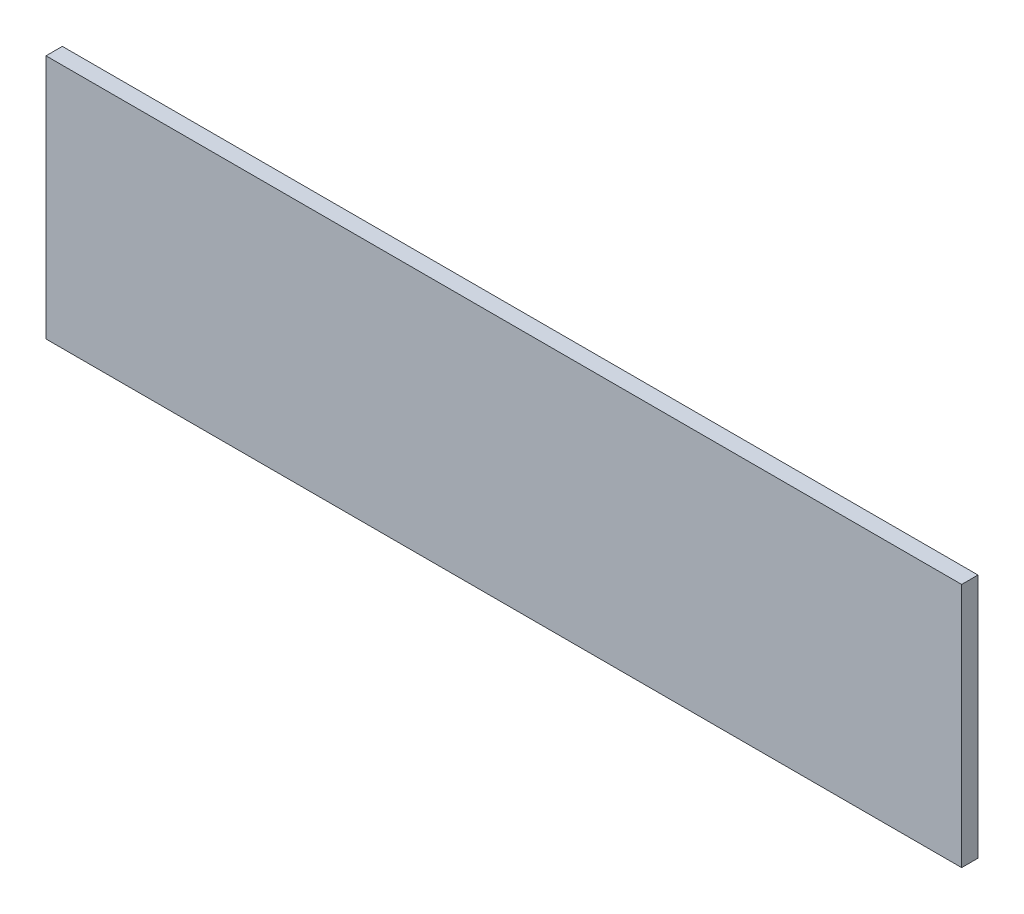
ISO-10303-21;
HEADER;
FILE_DESCRIPTION(('STEP AP214'),'2;1');
FILE_NAME('part.step','',(''),(''),'','','');
FILE_SCHEMA(('AUTOMOTIVE_DESIGN { 1 0 10303 214 1 1 1 1 }'));
ENDSEC;
DATA;
#1=APPLICATION_CONTEXT('core data for automotive mechanical design processes');
#2=APPLICATION_PROTOCOL_DEFINITION('international standard','automotive_design',2000,#1);
#3=PRODUCT_CONTEXT('',#1,'mechanical');
#4=PRODUCT('Part','Part','',(#3));
#5=PRODUCT_RELATED_PRODUCT_CATEGORY('part','',(#4));
#6=PRODUCT_DEFINITION_FORMATION('','',#4);
#7=PRODUCT_DEFINITION_CONTEXT('part definition',#1,'design');
#8=PRODUCT_DEFINITION('design','',#6,#7);
#9=PRODUCT_DEFINITION_SHAPE('','',#8);
#10=(LENGTH_UNIT() NAMED_UNIT(*) SI_UNIT(.MILLI.,.METRE.));
#11=(NAMED_UNIT(*) PLANE_ANGLE_UNIT() SI_UNIT($,.RADIAN.));
#12=(NAMED_UNIT(*) SI_UNIT($,.STERADIAN.) SOLID_ANGLE_UNIT());
#13=UNCERTAINTY_MEASURE_WITH_UNIT(LENGTH_MEASURE(1.E-05),#10,'distance_accuracy_value','');
#14=(GEOMETRIC_REPRESENTATION_CONTEXT(3) GLOBAL_UNCERTAINTY_ASSIGNED_CONTEXT((#13)) GLOBAL_UNIT_ASSIGNED_CONTEXT((#10,
#11,#12)) REPRESENTATION_CONTEXT('',''));
#15=CARTESIAN_POINT('',(0.,0.,0.));
#16=DIRECTION('',(0.,0.,1.));
#17=DIRECTION('',(1.,0.,0.));
#18=AXIS2_PLACEMENT_3D('',#15,#16,#17);
#19=CARTESIAN_POINT('',(58.5912127088598,23.6924554257886,1.));
#20=DIRECTION('',(-1.,0.,0.));
#21=DIRECTION('',(0.,0.,1.));
#22=AXIS2_PLACEMENT_3D('',#19,#20,#21);
#23=PLANE('',#22);
#24=DIRECTION('',(0.,1.,0.));
#25=VECTOR('',#24,1.);
#26=CARTESIAN_POINT('',(58.5912127088598,23.6924554257886,0.));
#27=LINE('',#26,#25);
#28=CARTESIAN_POINT('',(58.5912127088598,23.6924554257886,0.));
#29=VERTEX_POINT('',#28);
#30=CARTESIAN_POINT('',(58.5912127088598,38.6924554257886,0.));
#31=VERTEX_POINT('',#30);
#32=EDGE_CURVE('E102',#29,#31,#27,.T.);
#33=ORIENTED_EDGE('',*,*,#32,.T.);
#34=DIRECTION('',(0.,0.,-1.));
#35=VECTOR('',#34,1.);
#36=CARTESIAN_POINT('',(58.5912127088598,38.6924554257886,1.));
#37=LINE('',#36,#35);
#38=CARTESIAN_POINT('',(58.5912127088598,38.6924554257886,1.));
#39=VERTEX_POINT('',#38);
#40=EDGE_CURVE('E11',#39,#31,#37,.T.);
#41=ORIENTED_EDGE('',*,*,#40,.F.);
#42=DIRECTION('',(0.,1.,0.));
#43=VECTOR('',#42,1.);
#44=CARTESIAN_POINT('',(58.5912127088598,23.6924554257886,1.));
#45=LINE('',#44,#43);
#46=CARTESIAN_POINT('',(58.5912127088598,23.6924554257886,1.));
#47=VERTEX_POINT('',#46);
#48=EDGE_CURVE('E90',#47,#39,#45,.T.);
#49=ORIENTED_EDGE('',*,*,#48,.F.);
#50=DIRECTION('',(0.,0.,-1.));
#51=VECTOR('',#50,1.);
#52=CARTESIAN_POINT('',(58.5912127088598,23.6924554257886,1.));
#53=LINE('',#52,#51);
#54=EDGE_CURVE('E98',#47,#29,#53,.T.);
#55=ORIENTED_EDGE('',*,*,#54,.T.);
#56=EDGE_LOOP('',(#33,#41,#49,#55));
#57=FACE_BOUND('',#56,.T.);
#58=ADVANCED_FACE('F39',(#57),#23,.F.);
#59=CARTESIAN_POINT('',(58.5912127088598,38.6924554257886,1.));
#60=DIRECTION('',(0.,-1.,0.));
#61=DIRECTION('',(1.,0.,0.));
#62=AXIS2_PLACEMENT_3D('',#59,#60,#61);
#63=PLANE('',#62);
#64=DIRECTION('',(-1.,0.,0.));
#65=VECTOR('',#64,1.);
#66=CARTESIAN_POINT('',(58.5912127088598,38.6924554257886,0.));
#67=LINE('',#66,#65);
#68=CARTESIAN_POINT('',(2.59121270885976,38.6924554257886,0.));
#69=VERTEX_POINT('',#68);
#70=EDGE_CURVE('E94',#31,#69,#67,.T.);
#71=ORIENTED_EDGE('',*,*,#70,.T.);
#72=DIRECTION('',(0.,0.,-1.));
#73=VECTOR('',#72,1.);
#74=CARTESIAN_POINT('',(2.59121270885976,38.6924554257886,1.));
#75=LINE('',#74,#73);
#76=CARTESIAN_POINT('',(2.59121270885976,38.6924554257886,1.));
#77=VERTEX_POINT('',#76);
#78=EDGE_CURVE('E47',#77,#69,#75,.T.);
#79=ORIENTED_EDGE('',*,*,#78,.F.);
#80=DIRECTION('',(-1.,0.,0.));
#81=VECTOR('',#80,1.);
#82=CARTESIAN_POINT('',(58.5912127088598,38.6924554257886,1.));
#83=LINE('',#82,#81);
#84=EDGE_CURVE('E85',#39,#77,#83,.T.);
#85=ORIENTED_EDGE('',*,*,#84,.F.);
#86=ORIENTED_EDGE('',*,*,#40,.T.);
#87=EDGE_LOOP('',(#71,#79,#85,#86));
#88=FACE_BOUND('',#87,.T.);
#89=ADVANCED_FACE('F93',(#88),#63,.F.);
#90=CARTESIAN_POINT('',(2.59121270885976,23.6924554257886,1.));
#91=DIRECTION('',(1.,0.,0.));
#92=DIRECTION('',(0.,0.,-1.));
#93=AXIS2_PLACEMENT_3D('',#90,#91,#92);
#94=PLANE('',#93);
#95=DIRECTION('',(0.,-1.,0.));
#96=VECTOR('',#95,1.);
#97=CARTESIAN_POINT('',(2.59121270885976,23.6924554257886,0.));
#98=LINE('',#97,#96);
#99=CARTESIAN_POINT('',(2.59121270885976,23.6924554257886,0.));
#100=VERTEX_POINT('',#99);
#101=EDGE_CURVE('E72',#69,#100,#98,.T.);
#102=ORIENTED_EDGE('',*,*,#101,.T.);
#103=DIRECTION('',(0.,0.,-1.));
#104=VECTOR('',#103,1.);
#105=CARTESIAN_POINT('',(2.59121270885976,23.6924554257886,1.));
#106=LINE('',#105,#104);
#107=CARTESIAN_POINT('',(2.59121270885976,23.6924554257886,1.));
#108=VERTEX_POINT('',#107);
#109=EDGE_CURVE('E95',#108,#100,#106,.T.);
#110=ORIENTED_EDGE('',*,*,#109,.F.);
#111=DIRECTION('',(0.,-1.,0.));
#112=VECTOR('',#111,1.);
#113=CARTESIAN_POINT('',(2.59121270885976,23.6924554257886,1.));
#114=LINE('',#113,#112);
#115=EDGE_CURVE('E88',#77,#108,#114,.T.);
#116=ORIENTED_EDGE('',*,*,#115,.F.);
#117=ORIENTED_EDGE('',*,*,#78,.T.);
#118=EDGE_LOOP('',(#102,#110,#116,#117));
#119=FACE_BOUND('',#118,.T.);
#120=ADVANCED_FACE('F96',(#119),#94,.F.);
#121=CARTESIAN_POINT('',(58.5912127088598,23.6924554257886,1.));
#122=DIRECTION('',(0.,1.,0.));
#123=DIRECTION('',(-1.,0.,0.));
#124=AXIS2_PLACEMENT_3D('',#121,#122,#123);
#125=PLANE('',#124);
#126=DIRECTION('',(1.,0.,0.));
#127=VECTOR('',#126,1.);
#128=CARTESIAN_POINT('',(58.5912127088598,23.6924554257886,0.));
#129=LINE('',#128,#127);
#130=EDGE_CURVE('E78',#100,#29,#129,.T.);
#131=ORIENTED_EDGE('',*,*,#130,.T.);
#132=ORIENTED_EDGE('',*,*,#54,.F.);
#133=DIRECTION('',(1.,0.,0.));
#134=VECTOR('',#133,1.);
#135=CARTESIAN_POINT('',(58.5912127088598,23.6924554257886,1.));
#136=LINE('',#135,#134);
#137=EDGE_CURVE('E55',#108,#47,#136,.T.);
#138=ORIENTED_EDGE('',*,*,#137,.F.);
#139=ORIENTED_EDGE('',*,*,#109,.T.);
#140=EDGE_LOOP('',(#131,#132,#138,#139));
#141=FACE_BOUND('',#140,.T.);
#142=ADVANCED_FACE('F109',(#141),#125,.F.);
#143=CARTESIAN_POINT('',(0.,0.,1.));
#144=DIRECTION('',(0.,0.,1.));
#145=DIRECTION('',(1.,0.,0.));
#146=AXIS2_PLACEMENT_3D('',#143,#144,#145);
#147=PLANE('',#146);
#148=ORIENTED_EDGE('',*,*,#48,.T.);
#149=ORIENTED_EDGE('',*,*,#84,.T.);
#150=ORIENTED_EDGE('',*,*,#115,.T.);
#151=ORIENTED_EDGE('',*,*,#137,.T.);
#152=EDGE_LOOP('',(#148,#149,#150,#151));
#153=FACE_BOUND('',#152,.T.);
#154=ADVANCED_FACE('F86',(#153),#147,.T.);
#155=CARTESIAN_POINT('',(0.,0.,0.));
#156=DIRECTION('',(0.,0.,1.));
#157=DIRECTION('',(1.,0.,0.));
#158=AXIS2_PLACEMENT_3D('',#155,#156,#157);
#159=PLANE('',#158);
#160=ORIENTED_EDGE('',*,*,#32,.F.);
#161=ORIENTED_EDGE('',*,*,#130,.F.);
#162=ORIENTED_EDGE('',*,*,#101,.F.);
#163=ORIENTED_EDGE('',*,*,#70,.F.);
#164=EDGE_LOOP('',(#160,#161,#162,#163));
#165=FACE_BOUND('',#164,.T.);
#166=ADVANCED_FACE('F112',(#165),#159,.F.);
#167=CLOSED_SHELL('',(#58,#89,#120,#142,#154,#166));
#168=MANIFOLD_SOLID_BREP('B2',#167);
#169=ADVANCED_BREP_SHAPE_REPRESENTATION('',(#18,#168),#14);
#170=SHAPE_DEFINITION_REPRESENTATION(#9,#169);
ENDSEC;
END-ISO-10303-21;
